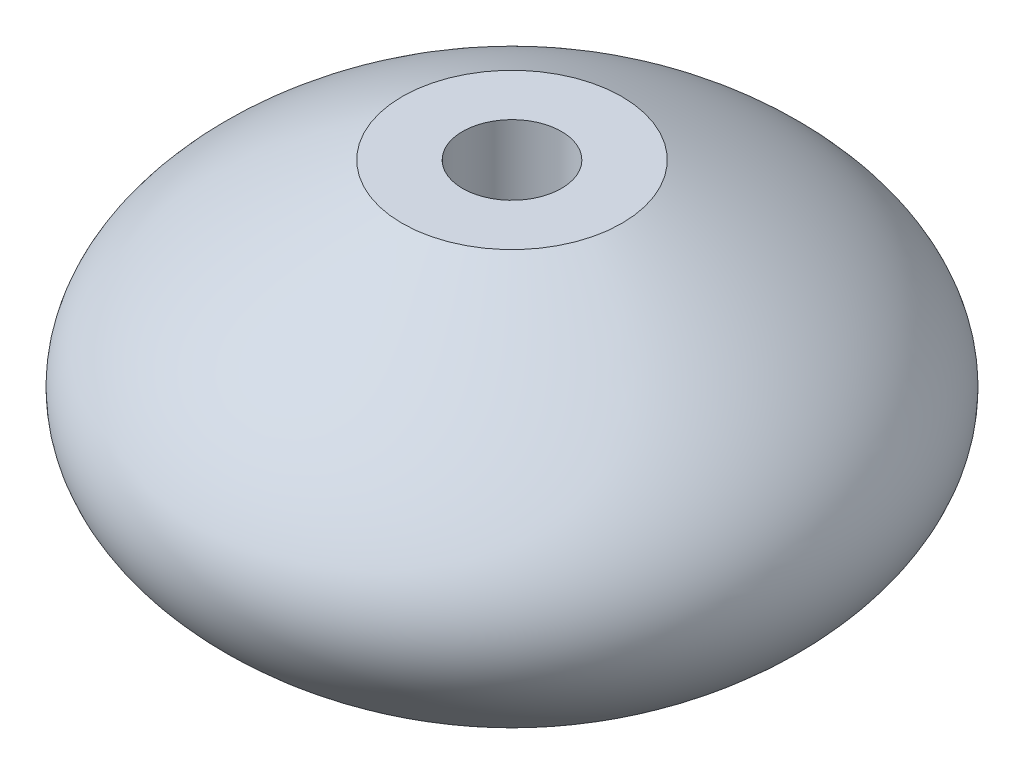
ISO-10303-21;
HEADER;
FILE_DESCRIPTION(('STEP AP214'),'2;1');
FILE_NAME('part.step','',(''),(''),'','','');
FILE_SCHEMA(('AUTOMOTIVE_DESIGN { 1 0 10303 214 1 1 1 1 }'));
ENDSEC;
DATA;
#1=APPLICATION_CONTEXT('core data for automotive mechanical design processes');
#2=APPLICATION_PROTOCOL_DEFINITION('international standard','automotive_design',2000,#1);
#3=PRODUCT_CONTEXT('',#1,'mechanical');
#4=PRODUCT('Part','Part','',(#3));
#5=PRODUCT_RELATED_PRODUCT_CATEGORY('part','',(#4));
#6=PRODUCT_DEFINITION_FORMATION('','',#4);
#7=PRODUCT_DEFINITION_CONTEXT('part definition',#1,'design');
#8=PRODUCT_DEFINITION('design','',#6,#7);
#9=PRODUCT_DEFINITION_SHAPE('','',#8);
#10=(LENGTH_UNIT() NAMED_UNIT(*) SI_UNIT(.MILLI.,.METRE.));
#11=(NAMED_UNIT(*) PLANE_ANGLE_UNIT() SI_UNIT($,.RADIAN.));
#12=(NAMED_UNIT(*) SI_UNIT($,.STERADIAN.) SOLID_ANGLE_UNIT());
#13=UNCERTAINTY_MEASURE_WITH_UNIT(LENGTH_MEASURE(1.E-05),#10,'distance_accuracy_value','');
#14=(GEOMETRIC_REPRESENTATION_CONTEXT(3) GLOBAL_UNCERTAINTY_ASSIGNED_CONTEXT((#13)) GLOBAL_UNIT_ASSIGNED_CONTEXT((#10,
#11,#12)) REPRESENTATION_CONTEXT('',''));
#15=CARTESIAN_POINT('',(0.,0.,0.));
#16=DIRECTION('',(0.,0.,1.));
#17=DIRECTION('',(1.,0.,0.));
#18=AXIS2_PLACEMENT_3D('',#15,#16,#17);
#19=CARTESIAN_POINT('',(0.,-8.95,0.));
#20=DIRECTION('',(0.,1.,0.));
#21=DIRECTION('',(0.,0.,1.));
#22=AXIS2_PLACEMENT_3D('',#19,#20,#21);
#23=PLANE('',#22);
#24=CARTESIAN_POINT('',(0.,-8.95,0.));
#25=DIRECTION('',(0.,1.,0.));
#26=DIRECTION('',(0.,0.,1.));
#27=AXIS2_PLACEMENT_3D('',#24,#25,#26);
#28=CIRCLE('',#27,2.25);
#29=CARTESIAN_POINT('',(0.,-8.95,2.25));
#30=VERTEX_POINT('',#29);
#31=EDGE_CURVE('E43',#30,#30,#28,.T.);
#32=ORIENTED_EDGE('',*,*,#31,.T.);
#33=EDGE_LOOP('',(#32));
#34=FACE_BOUND('',#33,.T.);
#35=CARTESIAN_POINT('',(0.,-8.95,0.));
#36=DIRECTION('',(0.,1.,0.));
#37=DIRECTION('',(0.,0.,1.));
#38=AXIS2_PLACEMENT_3D('',#35,#36,#37);
#39=CIRCLE('',#38,5.);
#40=CARTESIAN_POINT('',(0.,-8.95,5.));
#41=VERTEX_POINT('',#40);
#42=EDGE_CURVE('E10',#41,#41,#39,.T.);
#43=ORIENTED_EDGE('',*,*,#42,.F.);
#44=EDGE_LOOP('',(#43));
#45=FACE_BOUND('',#44,.T.);
#46=ADVANCED_FACE('F33',(#34,#45),#23,.F.);
#47=CARTESIAN_POINT('',(5.,-8.95,0.));
#48=CARTESIAN_POINT('',(25.,0.,0.));
#49=CARTESIAN_POINT('',(5.,8.95,0.));
#50=B_SPLINE_CURVE_WITH_KNOTS('',2,(#47,#48,#49),.UNSPECIFIED.,.F.,.F.,(3,3),(0.,1.),.UNSPECIFIED.);
#51=CARTESIAN_POINT('',(0.,8.95,0.));
#52=DIRECTION('',(0.,1.,0.));
#53=AXIS1_PLACEMENT('',#51,#52);
#54=SURFACE_OF_REVOLUTION('',#50,#53);
#55=CARTESIAN_POINT('',(0.,8.95,0.));
#56=DIRECTION('',(0.,1.,0.));
#57=DIRECTION('',(0.,0.,1.));
#58=AXIS2_PLACEMENT_3D('',#55,#56,#57);
#59=CIRCLE('',#58,5.);
#60=CARTESIAN_POINT('',(0.,8.95,5.));
#61=VERTEX_POINT('',#60);
#62=EDGE_CURVE('E39',#61,#61,#59,.T.);
#63=ORIENTED_EDGE('',*,*,#62,.F.);
#64=EDGE_LOOP('',(#63));
#65=FACE_BOUND('',#64,.T.);
#66=ORIENTED_EDGE('',*,*,#42,.T.);
#67=EDGE_LOOP('',(#66));
#68=FACE_BOUND('',#67,.T.);
#69=ADVANCED_FACE('F57',(#65,#68),#54,.T.);
#70=CARTESIAN_POINT('',(5.,8.95,0.));
#71=DIRECTION('',(0.,-1.,0.));
#72=DIRECTION('',(0.,0.,-1.));
#73=AXIS2_PLACEMENT_3D('',#70,#71,#72);
#74=PLANE('',#73);
#75=CARTESIAN_POINT('',(0.,8.95,0.));
#76=DIRECTION('',(0.,1.,0.));
#77=DIRECTION('',(0.,0.,1.));
#78=AXIS2_PLACEMENT_3D('',#75,#76,#77);
#79=CIRCLE('',#78,2.25);
#80=CARTESIAN_POINT('',(0.,8.95,2.25));
#81=VERTEX_POINT('',#80);
#82=EDGE_CURVE('E47',#81,#81,#79,.T.);
#83=ORIENTED_EDGE('',*,*,#82,.F.);
#84=EDGE_LOOP('',(#83));
#85=FACE_BOUND('',#84,.T.);
#86=ORIENTED_EDGE('',*,*,#62,.T.);
#87=EDGE_LOOP('',(#86));
#88=FACE_BOUND('',#87,.T.);
#89=ADVANCED_FACE('F60',(#85,#88),#74,.F.);
#90=CARTESIAN_POINT('',(0.,-8.95,0.));
#91=DIRECTION('',(0.,1.,0.));
#92=DIRECTION('',(0.,0.,1.));
#93=AXIS2_PLACEMENT_3D('',#90,#91,#92);
#94=CYLINDRICAL_SURFACE('',#93,2.25);
#95=CARTESIAN_POINT('',(0.,-8.95,2.25));
#96=CARTESIAN_POINT('',(0.,-8.76354166666667,2.25));
#97=CARTESIAN_POINT('',(0.,-8.57708333333333,2.25));
#98=CARTESIAN_POINT('',(0.,-8.20416666666666,2.25));
#99=CARTESIAN_POINT('',(0.,-8.01770833333333,2.25));
#100=CARTESIAN_POINT('',(0.,-7.64479166666666,2.25));
#101=CARTESIAN_POINT('',(0.,-7.45833333333333,2.25));
#102=CARTESIAN_POINT('',(0.,-7.08541666666666,2.25));
#103=CARTESIAN_POINT('',(0.,-6.89895833333333,2.25));
#104=CARTESIAN_POINT('',(0.,-6.52604166666666,2.25));
#105=CARTESIAN_POINT('',(0.,-6.33958333333333,2.25));
#106=CARTESIAN_POINT('',(0.,-5.96666666666666,2.25));
#107=CARTESIAN_POINT('',(0.,-5.78020833333333,2.25));
#108=CARTESIAN_POINT('',(0.,-5.40729166666666,2.25));
#109=CARTESIAN_POINT('',(0.,-5.22083333333333,2.25));
#110=CARTESIAN_POINT('',(0.,-4.84791666666666,2.25));
#111=CARTESIAN_POINT('',(0.,-4.66145833333333,2.25));
#112=CARTESIAN_POINT('',(0.,-4.28854166666666,2.25));
#113=CARTESIAN_POINT('',(0.,-4.10208333333333,2.25));
#114=CARTESIAN_POINT('',(0.,-3.72916666666666,2.25));
#115=CARTESIAN_POINT('',(0.,-3.54270833333333,2.25));
#116=CARTESIAN_POINT('',(0.,-3.16979166666667,2.25));
#117=CARTESIAN_POINT('',(0.,-2.98333333333333,2.25));
#118=CARTESIAN_POINT('',(0.,-2.61041666666666,2.25));
#119=CARTESIAN_POINT('',(0.,-2.42395833333333,2.25));
#120=CARTESIAN_POINT('',(0.,-2.05104166666667,2.25));
#121=CARTESIAN_POINT('',(0.,-1.86458333333333,2.25));
#122=CARTESIAN_POINT('',(0.,-1.49166666666667,2.25));
#123=CARTESIAN_POINT('',(0.,-1.30520833333333,2.25));
#124=CARTESIAN_POINT('',(0.,-0.932291666666667,2.25));
#125=CARTESIAN_POINT('',(0.,-0.745833333333334,2.25));
#126=CARTESIAN_POINT('',(0.,-0.372916666666667,2.25));
#127=CARTESIAN_POINT('',(0.,-0.186458333333334,2.25));
#128=CARTESIAN_POINT('',(0.,0.186458333333334,2.25));
#129=CARTESIAN_POINT('',(0.,0.372916666666667,2.25));
#130=CARTESIAN_POINT('',(0.,0.745833333333334,2.25));
#131=CARTESIAN_POINT('',(0.,0.932291666666667,2.25));
#132=CARTESIAN_POINT('',(0.,1.30520833333333,2.25));
#133=CARTESIAN_POINT('',(0.,1.49166666666667,2.25));
#134=CARTESIAN_POINT('',(0.,1.86458333333333,2.25));
#135=CARTESIAN_POINT('',(0.,2.05104166666667,2.25));
#136=CARTESIAN_POINT('',(0.,2.42395833333333,2.25));
#137=CARTESIAN_POINT('',(0.,2.61041666666667,2.25));
#138=CARTESIAN_POINT('',(0.,2.98333333333333,2.25));
#139=CARTESIAN_POINT('',(0.,3.16979166666667,2.25));
#140=CARTESIAN_POINT('',(0.,3.54270833333333,2.25));
#141=CARTESIAN_POINT('',(0.,3.72916666666667,2.25));
#142=CARTESIAN_POINT('',(0.,4.10208333333333,2.25));
#143=CARTESIAN_POINT('',(0.,4.28854166666667,2.25));
#144=CARTESIAN_POINT('',(0.,4.66145833333333,2.25));
#145=CARTESIAN_POINT('',(0.,4.84791666666667,2.25));
#146=CARTESIAN_POINT('',(0.,5.22083333333333,2.25));
#147=CARTESIAN_POINT('',(0.,5.40729166666667,2.25));
#148=CARTESIAN_POINT('',(0.,5.78020833333333,2.25));
#149=CARTESIAN_POINT('',(0.,5.96666666666667,2.25));
#150=CARTESIAN_POINT('',(0.,6.33958333333333,2.25));
#151=CARTESIAN_POINT('',(0.,6.52604166666667,2.25));
#152=CARTESIAN_POINT('',(0.,6.89895833333333,2.25));
#153=CARTESIAN_POINT('',(0.,7.08541666666667,2.25));
#154=CARTESIAN_POINT('',(0.,7.45833333333333,2.25));
#155=CARTESIAN_POINT('',(0.,7.64479166666667,2.25));
#156=CARTESIAN_POINT('',(0.,8.01770833333333,2.25));
#157=CARTESIAN_POINT('',(0.,8.20416666666667,2.25));
#158=CARTESIAN_POINT('',(0.,8.57708333333333,2.25));
#159=CARTESIAN_POINT('',(0.,8.76354166666667,2.25));
#160=CARTESIAN_POINT('',(0.,8.95,2.25));
#161=B_SPLINE_CURVE_WITH_KNOTS('',3,(#95,#96,#97,#98,#99,#100,#101,#102,#103,#104,#105,#106,
#107,#108,#109,#110,#111,#112,#113,#114,#115,#116,#117,#118,#119,#120,#121,#122,#123,#124,#125,
#126,#127,#128,#129,#130,#131,#132,#133,#134,#135,#136,#137,#138,#139,#140,#141,#142,#143,#144,
#145,#146,#147,#148,#149,#150,#151,#152,#153,#154,#155,#156,#157,#158,#159,#160),.UNSPECIFIED.,
.F.,.F.,(4,2,2,2,2,2,2,2,2,2,2,2,2,2,2,2,2,2,2,2,2,2,2,2,2,2,2,2,2,2,2,2,4),(0.,
0.559375000000001,1.11875,1.678125,2.2375,2.796875,3.35625,3.915625,4.475,5.034375,5.59375,
6.153125,6.7125,7.271875,7.83125,8.390625,8.95,9.509375,10.06875,10.628125,11.1875,11.746875,
12.30625,12.865625,13.425,13.984375,14.54375,15.103125,15.6625,16.221875,16.78125,17.340625,
17.9),.UNSPECIFIED.);
#162=EDGE_CURVE('BSEAM64',#30,#81,#161,.T.);
#163=ORIENTED_EDGE('',*,*,#31,.F.);
#164=ORIENTED_EDGE('',*,*,#82,.T.);
#165=ORIENTED_EDGE('',*,*,#162,.T.);
#166=ORIENTED_EDGE('',*,*,#162,.F.);
#167=EDGE_LOOP('',(#163,#165,#164,#166));
#168=FACE_BOUND('',#167,.T.);
#169=ADVANCED_FACE('F64',(#168),#94,.F.);
#170=CLOSED_SHELL('',(#46,#69,#89,#169));
#171=MANIFOLD_SOLID_BREP('B2',#170);
#172=ADVANCED_BREP_SHAPE_REPRESENTATION('',(#18,#171),#14);
#173=SHAPE_DEFINITION_REPRESENTATION(#9,#172);
ENDSEC;
END-ISO-10303-21;
